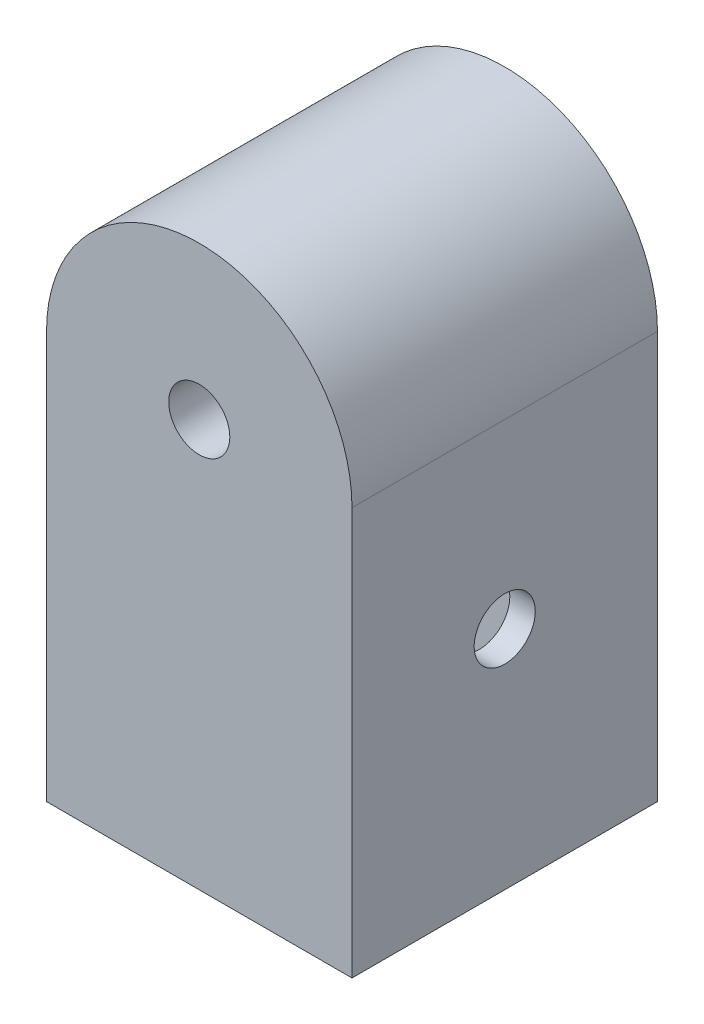
ISO-10303-21;
HEADER;
FILE_DESCRIPTION(('STEP AP214'),'2;1');
FILE_NAME('part.step','',(''),(''),'','','');
FILE_SCHEMA(('AUTOMOTIVE_DESIGN { 1 0 10303 214 1 1 1 1 }'));
ENDSEC;
DATA;
#1=APPLICATION_CONTEXT('core data for automotive mechanical design processes');
#2=APPLICATION_PROTOCOL_DEFINITION('international standard','automotive_design',2000,#1);
#3=PRODUCT_CONTEXT('',#1,'mechanical');
#4=PRODUCT('Part','Part','',(#3));
#5=PRODUCT_RELATED_PRODUCT_CATEGORY('part','',(#4));
#6=PRODUCT_DEFINITION_FORMATION('','',#4);
#7=PRODUCT_DEFINITION_CONTEXT('part definition',#1,'design');
#8=PRODUCT_DEFINITION('design','',#6,#7);
#9=PRODUCT_DEFINITION_SHAPE('','',#8);
#10=(LENGTH_UNIT() NAMED_UNIT(*) SI_UNIT(.MILLI.,.METRE.));
#11=(NAMED_UNIT(*) PLANE_ANGLE_UNIT() SI_UNIT($,.RADIAN.));
#12=(NAMED_UNIT(*) SI_UNIT($,.STERADIAN.) SOLID_ANGLE_UNIT());
#13=UNCERTAINTY_MEASURE_WITH_UNIT(LENGTH_MEASURE(1.E-05),#10,'distance_accuracy_value','');
#14=(GEOMETRIC_REPRESENTATION_CONTEXT(3) GLOBAL_UNCERTAINTY_ASSIGNED_CONTEXT((#13)) GLOBAL_UNIT_ASSIGNED_CONTEXT((#10,
#11,#12)) REPRESENTATION_CONTEXT('',''));
#15=CARTESIAN_POINT('',(0.,0.,0.));
#16=DIRECTION('',(0.,0.,1.));
#17=DIRECTION('',(1.,0.,0.));
#18=AXIS2_PLACEMENT_3D('',#15,#16,#17);
#19=CARTESIAN_POINT('',(7.5,20.,-7.5));
#20=DIRECTION('',(-1.,0.,0.));
#21=DIRECTION('',(0.,0.,1.));
#22=AXIS2_PLACEMENT_3D('',#19,#20,#21);
#23=PLANE('',#22);
#24=CARTESIAN_POINT('',(7.5,11.0968575150693,0.));
#25=DIRECTION('',(1.,0.,0.));
#26=DIRECTION('',(0.,0.,-1.));
#27=AXIS2_PLACEMENT_3D('',#24,#25,#26);
#28=CIRCLE('',#27,1.5);
#29=CARTESIAN_POINT('',(7.5,11.0968575150693,-1.5));
#30=VERTEX_POINT('',#29);
#31=EDGE_CURVE('E180',#30,#30,#28,.T.);
#32=ORIENTED_EDGE('',*,*,#31,.F.);
#33=EDGE_LOOP('',(#32));
#34=FACE_BOUND('',#33,.T.);
#35=DIRECTION('',(0.,0.,-1.));
#36=VECTOR('',#35,1.);
#37=CARTESIAN_POINT('',(7.5,0.,-7.5));
#38=LINE('',#37,#36);
#39=CARTESIAN_POINT('',(7.5,0.,7.5));
#40=VERTEX_POINT('',#39);
#41=CARTESIAN_POINT('',(7.5,0.,-7.5));
#42=VERTEX_POINT('',#41);
#43=EDGE_CURVE('E160',#40,#42,#38,.T.);
#44=ORIENTED_EDGE('',*,*,#43,.T.);
#45=DIRECTION('',(0.,-1.,0.));
#46=VECTOR('',#45,1.);
#47=CARTESIAN_POINT('',(7.5,20.,-7.5));
#48=LINE('',#47,#46);
#49=CARTESIAN_POINT('',(7.5,20.,-7.5));
#50=VERTEX_POINT('',#49);
#51=EDGE_CURVE('E11',#50,#42,#48,.T.);
#52=ORIENTED_EDGE('',*,*,#51,.F.);
#53=DIRECTION('',(0.,0.,-1.));
#54=VECTOR('',#53,1.);
#55=CARTESIAN_POINT('',(7.5,20.,-7.5));
#56=LINE('',#55,#54);
#57=CARTESIAN_POINT('',(7.5,20.,7.5));
#58=VERTEX_POINT('',#57);
#59=EDGE_CURVE('E118',#58,#50,#56,.T.);
#60=ORIENTED_EDGE('',*,*,#59,.F.);
#61=DIRECTION('',(0.,-1.,0.));
#62=VECTOR('',#61,1.);
#63=CARTESIAN_POINT('',(7.5,20.,7.5));
#64=LINE('',#63,#62);
#65=EDGE_CURVE('E62',#58,#40,#64,.T.);
#66=ORIENTED_EDGE('',*,*,#65,.T.);
#67=EDGE_LOOP('',(#44,#52,#60,#66));
#68=FACE_BOUND('',#67,.T.);
#69=ADVANCED_FACE('F38',(#34,#68),#23,.F.);
#70=CARTESIAN_POINT('',(-7.5,20.,-7.5));
#71=DIRECTION('',(0.,0.,1.));
#72=DIRECTION('',(1.,0.,0.));
#73=AXIS2_PLACEMENT_3D('',#70,#71,#72);
#74=PLANE('',#73);
#75=CARTESIAN_POINT('',(0.,20.,-7.5));
#76=DIRECTION('',(0.,0.,1.));
#77=DIRECTION('',(1.,0.,0.));
#78=AXIS2_PLACEMENT_3D('',#75,#76,#77);
#79=CIRCLE('',#78,1.5);
#80=CARTESIAN_POINT('',(1.5,20.,-7.5));
#81=VERTEX_POINT('',#80);
#82=EDGE_CURVE('E183',#81,#81,#79,.T.);
#83=ORIENTED_EDGE('',*,*,#82,.T.);
#84=EDGE_LOOP('',(#83));
#85=FACE_BOUND('',#84,.T.);
#86=DIRECTION('',(-1.,0.,0.));
#87=VECTOR('',#86,1.);
#88=CARTESIAN_POINT('',(-7.5,0.,-7.5));
#89=LINE('',#88,#87);
#90=CARTESIAN_POINT('',(-7.5,0.,-7.5));
#91=VERTEX_POINT('',#90);
#92=EDGE_CURVE('E124',#42,#91,#89,.T.);
#93=ORIENTED_EDGE('',*,*,#92,.T.);
#94=DIRECTION('',(0.,-1.,0.));
#95=VECTOR('',#94,1.);
#96=CARTESIAN_POINT('',(-7.5,20.,-7.5));
#97=LINE('',#96,#95);
#98=CARTESIAN_POINT('',(-7.5,20.,-7.5));
#99=VERTEX_POINT('',#98);
#100=EDGE_CURVE('E46',#99,#91,#97,.T.);
#101=ORIENTED_EDGE('',*,*,#100,.F.);
#102=CARTESIAN_POINT('',(0.,20.,-7.5));
#103=DIRECTION('',(0.,0.,-1.));
#104=DIRECTION('',(-1.,0.,0.));
#105=AXIS2_PLACEMENT_3D('',#102,#103,#104);
#106=CIRCLE('',#105,7.5);
#107=EDGE_CURVE('E123',#99,#50,#106,.T.);
#108=ORIENTED_EDGE('',*,*,#107,.T.);
#109=ORIENTED_EDGE('',*,*,#51,.T.);
#110=EDGE_LOOP('',(#93,#101,#108,#109));
#111=FACE_BOUND('',#110,.T.);
#112=ADVANCED_FACE('F122',(#85,#111),#74,.F.);
#113=CARTESIAN_POINT('',(-7.5,20.,-7.5));
#114=DIRECTION('',(1.,0.,0.));
#115=DIRECTION('',(0.,0.,-1.));
#116=AXIS2_PLACEMENT_3D('',#113,#114,#115);
#117=PLANE('',#116);
#118=CARTESIAN_POINT('',(-7.5,11.0968575150693,0.));
#119=DIRECTION('',(1.,0.,0.));
#120=DIRECTION('',(0.,0.,-1.));
#121=AXIS2_PLACEMENT_3D('',#118,#119,#120);
#122=CIRCLE('',#121,1.5);
#123=CARTESIAN_POINT('',(-7.5,11.0968575150693,-1.5));
#124=VERTEX_POINT('',#123);
#125=EDGE_CURVE('E182',#124,#124,#122,.T.);
#126=ORIENTED_EDGE('',*,*,#125,.T.);
#127=EDGE_LOOP('',(#126));
#128=FACE_BOUND('',#127,.T.);
#129=DIRECTION('',(0.,0.,1.));
#130=VECTOR('',#129,1.);
#131=CARTESIAN_POINT('',(-7.5,0.,-7.5));
#132=LINE('',#131,#130);
#133=CARTESIAN_POINT('',(-7.5,0.,7.5));
#134=VERTEX_POINT('',#133);
#135=EDGE_CURVE('E164',#91,#134,#132,.T.);
#136=ORIENTED_EDGE('',*,*,#135,.T.);
#137=DIRECTION('',(0.,-1.,0.));
#138=VECTOR('',#137,1.);
#139=CARTESIAN_POINT('',(-7.5,20.,7.5));
#140=LINE('',#139,#138);
#141=CARTESIAN_POINT('',(-7.5,20.,7.5));
#142=VERTEX_POINT('',#141);
#143=EDGE_CURVE('E114',#142,#134,#140,.T.);
#144=ORIENTED_EDGE('',*,*,#143,.F.);
#145=DIRECTION('',(0.,0.,1.));
#146=VECTOR('',#145,1.);
#147=CARTESIAN_POINT('',(-7.5,20.,-7.5));
#148=LINE('',#147,#146);
#149=EDGE_CURVE('E110',#99,#142,#148,.T.);
#150=ORIENTED_EDGE('',*,*,#149,.F.);
#151=ORIENTED_EDGE('',*,*,#100,.T.);
#152=EDGE_LOOP('',(#136,#144,#150,#151));
#153=FACE_BOUND('',#152,.T.);
#154=ADVANCED_FACE('F112',(#128,#153),#117,.F.);
#155=CARTESIAN_POINT('',(-7.5,20.,7.5));
#156=DIRECTION('',(0.,0.,-1.));
#157=DIRECTION('',(-1.,0.,0.));
#158=AXIS2_PLACEMENT_3D('',#155,#156,#157);
#159=PLANE('',#158);
#160=CARTESIAN_POINT('',(0.,20.,7.5));
#161=DIRECTION('',(0.,0.,1.));
#162=DIRECTION('',(1.,0.,0.));
#163=AXIS2_PLACEMENT_3D('',#160,#161,#162);
#164=CIRCLE('',#163,1.5);
#165=CARTESIAN_POINT('',(1.5,20.,7.5));
#166=VERTEX_POINT('',#165);
#167=EDGE_CURVE('E188',#166,#166,#164,.T.);
#168=ORIENTED_EDGE('',*,*,#167,.F.);
#169=EDGE_LOOP('',(#168));
#170=FACE_BOUND('',#169,.T.);
#171=DIRECTION('',(1.,0.,0.));
#172=VECTOR('',#171,1.);
#173=CARTESIAN_POINT('',(-7.5,0.,7.5));
#174=LINE('',#173,#172);
#175=EDGE_CURVE('E81',#134,#40,#174,.T.);
#176=ORIENTED_EDGE('',*,*,#175,.T.);
#177=ORIENTED_EDGE('',*,*,#65,.F.);
#178=CARTESIAN_POINT('',(0.,20.,7.5));
#179=DIRECTION('',(0.,0.,-1.));
#180=DIRECTION('',(-1.,0.,0.));
#181=AXIS2_PLACEMENT_3D('',#178,#179,#180);
#182=CIRCLE('',#181,7.5);
#183=EDGE_CURVE('E127',#142,#58,#182,.T.);
#184=ORIENTED_EDGE('',*,*,#183,.F.);
#185=ORIENTED_EDGE('',*,*,#143,.T.);
#186=EDGE_LOOP('',(#176,#177,#184,#185));
#187=FACE_BOUND('',#186,.T.);
#188=ADVANCED_FACE('F168',(#170,#187),#159,.F.);
#189=CARTESIAN_POINT('',(0.,0.,0.));
#190=DIRECTION('',(0.,1.,0.));
#191=DIRECTION('',(0.,0.,1.));
#192=AXIS2_PLACEMENT_3D('',#189,#190,#191);
#193=PLANE('',#192);
#194=DIRECTION('',(-1.,0.,0.));
#195=VECTOR('',#194,1.);
#196=CARTESIAN_POINT('',(-6.25,0.,6.25));
#197=LINE('',#196,#195);
#198=CARTESIAN_POINT('',(6.25,0.,6.25));
#199=VERTEX_POINT('',#198);
#200=CARTESIAN_POINT('',(-6.25,0.,6.25));
#201=VERTEX_POINT('',#200);
#202=EDGE_CURVE('E137',#199,#201,#197,.T.);
#203=ORIENTED_EDGE('',*,*,#202,.F.);
#204=DIRECTION('',(0.,0.,1.));
#205=VECTOR('',#204,1.);
#206=CARTESIAN_POINT('',(6.25,0.,-6.25));
#207=LINE('',#206,#205);
#208=CARTESIAN_POINT('',(6.25,0.,-6.25));
#209=VERTEX_POINT('',#208);
#210=EDGE_CURVE('E140',#209,#199,#207,.T.);
#211=ORIENTED_EDGE('',*,*,#210,.F.);
#212=DIRECTION('',(1.,0.,0.));
#213=VECTOR('',#212,1.);
#214=CARTESIAN_POINT('',(-6.25,0.,-6.25));
#215=LINE('',#214,#213);
#216=CARTESIAN_POINT('',(-6.25,0.,-6.25));
#217=VERTEX_POINT('',#216);
#218=EDGE_CURVE('E142',#217,#209,#215,.T.);
#219=ORIENTED_EDGE('',*,*,#218,.F.);
#220=DIRECTION('',(0.,0.,-1.));
#221=VECTOR('',#220,1.);
#222=CARTESIAN_POINT('',(-6.25,0.,-6.25));
#223=LINE('',#222,#221);
#224=EDGE_CURVE('E135',#201,#217,#223,.T.);
#225=ORIENTED_EDGE('',*,*,#224,.F.);
#226=EDGE_LOOP('',(#203,#211,#219,#225));
#227=FACE_BOUND('',#226,.T.);
#228=ORIENTED_EDGE('',*,*,#43,.F.);
#229=ORIENTED_EDGE('',*,*,#175,.F.);
#230=ORIENTED_EDGE('',*,*,#135,.F.);
#231=ORIENTED_EDGE('',*,*,#92,.F.);
#232=EDGE_LOOP('',(#228,#229,#230,#231));
#233=FACE_BOUND('',#232,.T.);
#234=ADVANCED_FACE('F171',(#227,#233),#193,.F.);
#235=CARTESIAN_POINT('',(6.25,-17.6776695296637,-6.25));
#236=DIRECTION('',(1.,0.,0.));
#237=DIRECTION('',(0.,0.,-1.));
#238=AXIS2_PLACEMENT_3D('',#235,#236,#237);
#239=PLANE('',#238);
#240=CARTESIAN_POINT('',(6.25,11.0968575150693,0.));
#241=DIRECTION('',(1.,0.,0.));
#242=DIRECTION('',(0.,0.,-1.));
#243=AXIS2_PLACEMENT_3D('',#240,#241,#242);
#244=CIRCLE('',#243,1.5);
#245=CARTESIAN_POINT('',(6.25,11.0968575150693,-1.5));
#246=VERTEX_POINT('',#245);
#247=EDGE_CURVE('E128',#246,#246,#244,.T.);
#248=ORIENTED_EDGE('',*,*,#247,.T.);
#249=EDGE_LOOP('',(#248));
#250=FACE_BOUND('',#249,.T.);
#251=ORIENTED_EDGE('',*,*,#210,.T.);
#252=DIRECTION('',(0.,1.,0.));
#253=VECTOR('',#252,1.);
#254=CARTESIAN_POINT('',(6.25,-17.6776695296637,6.25));
#255=LINE('',#254,#253);
#256=CARTESIAN_POINT('',(6.25,17.,6.25));
#257=VERTEX_POINT('',#256);
#258=EDGE_CURVE('E138',#199,#257,#255,.T.);
#259=ORIENTED_EDGE('',*,*,#258,.T.);
#260=DIRECTION('',(0.,0.,-1.));
#261=VECTOR('',#260,1.);
#262=CARTESIAN_POINT('',(6.25,17.,-6.25));
#263=LINE('',#262,#261);
#264=CARTESIAN_POINT('',(6.25,17.,-6.25));
#265=VERTEX_POINT('',#264);
#266=EDGE_CURVE('E130',#257,#265,#263,.T.);
#267=ORIENTED_EDGE('',*,*,#266,.T.);
#268=DIRECTION('',(0.,1.,0.));
#269=VECTOR('',#268,1.);
#270=CARTESIAN_POINT('',(6.25,-17.6776695296637,-6.25));
#271=LINE('',#270,#269);
#272=EDGE_CURVE('E153',#209,#265,#271,.T.);
#273=ORIENTED_EDGE('',*,*,#272,.F.);
#274=EDGE_LOOP('',(#251,#259,#267,#273));
#275=FACE_BOUND('',#274,.T.);
#276=ADVANCED_FACE('F202',(#250,#275),#239,.F.);
#277=CARTESIAN_POINT('',(-6.25,-17.6776695296637,6.25));
#278=DIRECTION('',(0.,0.,1.));
#279=DIRECTION('',(1.,0.,0.));
#280=AXIS2_PLACEMENT_3D('',#277,#278,#279);
#281=PLANE('',#280);
#282=ORIENTED_EDGE('',*,*,#202,.T.);
#283=DIRECTION('',(0.,1.,0.));
#284=VECTOR('',#283,1.);
#285=CARTESIAN_POINT('',(-6.25,-17.6776695296637,6.25));
#286=LINE('',#285,#284);
#287=CARTESIAN_POINT('',(-6.25,17.,6.25));
#288=VERTEX_POINT('',#287);
#289=EDGE_CURVE('E155',#201,#288,#286,.T.);
#290=ORIENTED_EDGE('',*,*,#289,.T.);
#291=DIRECTION('',(1.,0.,0.));
#292=VECTOR('',#291,1.);
#293=CARTESIAN_POINT('',(-6.25,17.,6.25));
#294=LINE('',#293,#292);
#295=EDGE_CURVE('E150',#288,#257,#294,.T.);
#296=ORIENTED_EDGE('',*,*,#295,.T.);
#297=ORIENTED_EDGE('',*,*,#258,.F.);
#298=EDGE_LOOP('',(#282,#290,#296,#297));
#299=FACE_BOUND('',#298,.T.);
#300=ADVANCED_FACE('F210',(#299),#281,.F.);
#301=CARTESIAN_POINT('',(-6.25,-17.6776695296637,-6.25));
#302=DIRECTION('',(-1.,0.,0.));
#303=DIRECTION('',(0.,0.,1.));
#304=AXIS2_PLACEMENT_3D('',#301,#302,#303);
#305=PLANE('',#304);
#306=CARTESIAN_POINT('',(-6.25,11.0968575150693,0.));
#307=DIRECTION('',(-1.,0.,0.));
#308=DIRECTION('',(0.,0.,1.));
#309=AXIS2_PLACEMENT_3D('',#306,#307,#308);
#310=CIRCLE('',#309,1.5);
#311=CARTESIAN_POINT('',(-6.25,11.0968575150693,-1.5));
#312=VERTEX_POINT('',#311);
#313=EDGE_CURVE('E41',#312,#312,#310,.T.);
#314=ORIENTED_EDGE('',*,*,#313,.T.);
#315=EDGE_LOOP('',(#314));
#316=FACE_BOUND('',#315,.T.);
#317=ORIENTED_EDGE('',*,*,#224,.T.);
#318=DIRECTION('',(0.,1.,0.));
#319=VECTOR('',#318,1.);
#320=CARTESIAN_POINT('',(-6.25,-17.6776695296637,-6.25));
#321=LINE('',#320,#319);
#322=CARTESIAN_POINT('',(-6.25,17.,-6.25));
#323=VERTEX_POINT('',#322);
#324=EDGE_CURVE('E53',#217,#323,#321,.T.);
#325=ORIENTED_EDGE('',*,*,#324,.T.);
#326=DIRECTION('',(0.,0.,1.));
#327=VECTOR('',#326,1.);
#328=CARTESIAN_POINT('',(-6.25,17.,-6.25));
#329=LINE('',#328,#327);
#330=EDGE_CURVE('E147',#323,#288,#329,.T.);
#331=ORIENTED_EDGE('',*,*,#330,.T.);
#332=ORIENTED_EDGE('',*,*,#289,.F.);
#333=EDGE_LOOP('',(#317,#325,#331,#332));
#334=FACE_BOUND('',#333,.T.);
#335=ADVANCED_FACE('F216',(#316,#334),#305,.F.);
#336=CARTESIAN_POINT('',(-6.25,-17.6776695296637,-6.25));
#337=DIRECTION('',(0.,0.,-1.));
#338=DIRECTION('',(-1.,0.,0.));
#339=AXIS2_PLACEMENT_3D('',#336,#337,#338);
#340=PLANE('',#339);
#341=ORIENTED_EDGE('',*,*,#218,.T.);
#342=ORIENTED_EDGE('',*,*,#272,.T.);
#343=DIRECTION('',(-1.,0.,0.));
#344=VECTOR('',#343,1.);
#345=CARTESIAN_POINT('',(-6.25,17.,-6.25));
#346=LINE('',#345,#344);
#347=EDGE_CURVE('E145',#265,#323,#346,.T.);
#348=ORIENTED_EDGE('',*,*,#347,.T.);
#349=ORIENTED_EDGE('',*,*,#324,.F.);
#350=EDGE_LOOP('',(#341,#342,#348,#349));
#351=FACE_BOUND('',#350,.T.);
#352=ADVANCED_FACE('F212',(#351),#340,.F.);
#353=CARTESIAN_POINT('',(0.,17.,0.));
#354=DIRECTION('',(0.,1.,0.));
#355=DIRECTION('',(0.,0.,1.));
#356=AXIS2_PLACEMENT_3D('',#353,#354,#355);
#357=PLANE('',#356);
#358=ORIENTED_EDGE('',*,*,#266,.F.);
#359=ORIENTED_EDGE('',*,*,#295,.F.);
#360=ORIENTED_EDGE('',*,*,#330,.F.);
#361=ORIENTED_EDGE('',*,*,#347,.F.);
#362=EDGE_LOOP('',(#358,#359,#360,#361));
#363=FACE_BOUND('',#362,.T.);
#364=ADVANCED_FACE('F215',(#363),#357,.F.);
#365=CARTESIAN_POINT('',(0.,20.,7.5));
#366=DIRECTION('',(0.,0.,-1.));
#367=DIRECTION('',(-1.,0.,0.));
#368=AXIS2_PLACEMENT_3D('',#365,#366,#367);
#369=CYLINDRICAL_SURFACE('',#368,7.5);
#370=ORIENTED_EDGE('',*,*,#107,.F.);
#371=ORIENTED_EDGE('',*,*,#149,.T.);
#372=ORIENTED_EDGE('',*,*,#183,.T.);
#373=ORIENTED_EDGE('',*,*,#59,.T.);
#374=EDGE_LOOP('',(#370,#371,#372,#373));
#375=FACE_BOUND('',#374,.T.);
#376=ADVANCED_FACE('F126',(#375),#369,.T.);
#377=CARTESIAN_POINT('',(-7.5,11.0968575150693,0.));
#378=DIRECTION('',(1.,0.,0.));
#379=DIRECTION('',(0.,0.,-1.));
#380=AXIS2_PLACEMENT_3D('',#377,#378,#379);
#381=CYLINDRICAL_SURFACE('',#380,1.5);
#382=CARTESIAN_POINT('',(-7.5,11.0968575150693,-1.5));
#383=CARTESIAN_POINT('',(-7.48697916666667,11.0968575150693,-1.5));
#384=CARTESIAN_POINT('',(-7.47395833333334,11.0968575150693,-1.5));
#385=CARTESIAN_POINT('',(-7.44791666666667,11.0968575150693,-1.5));
#386=CARTESIAN_POINT('',(-7.43489583333334,11.0968575150693,-1.5));
#387=CARTESIAN_POINT('',(-7.40885416666667,11.0968575150693,-1.5));
#388=CARTESIAN_POINT('',(-7.39583333333334,11.0968575150693,-1.5));
#389=CARTESIAN_POINT('',(-7.36979166666667,11.0968575150693,-1.5));
#390=CARTESIAN_POINT('',(-7.35677083333334,11.0968575150693,-1.5));
#391=CARTESIAN_POINT('',(-7.33072916666667,11.0968575150693,-1.5));
#392=CARTESIAN_POINT('',(-7.31770833333334,11.0968575150693,-1.5));
#393=CARTESIAN_POINT('',(-7.29166666666667,11.0968575150693,-1.5));
#394=CARTESIAN_POINT('',(-7.27864583333334,11.0968575150693,-1.5));
#395=CARTESIAN_POINT('',(-7.25260416666667,11.0968575150693,-1.5));
#396=CARTESIAN_POINT('',(-7.23958333333334,11.0968575150693,-1.5));
#397=CARTESIAN_POINT('',(-7.21354166666667,11.0968575150693,-1.5));
#398=CARTESIAN_POINT('',(-7.20052083333334,11.0968575150693,-1.5));
#399=CARTESIAN_POINT('',(-7.17447916666667,11.0968575150693,-1.5));
#400=CARTESIAN_POINT('',(-7.16145833333334,11.0968575150693,-1.5));
#401=CARTESIAN_POINT('',(-7.13541666666667,11.0968575150693,-1.5));
#402=CARTESIAN_POINT('',(-7.12239583333334,11.0968575150693,-1.5));
#403=CARTESIAN_POINT('',(-7.09635416666667,11.0968575150693,-1.5));
#404=CARTESIAN_POINT('',(-7.08333333333334,11.0968575150693,-1.5));
#405=CARTESIAN_POINT('',(-7.05729166666667,11.0968575150693,-1.5));
#406=CARTESIAN_POINT('',(-7.04427083333334,11.0968575150693,-1.5));
#407=CARTESIAN_POINT('',(-7.01822916666667,11.0968575150693,-1.5));
#408=CARTESIAN_POINT('',(-7.00520833333334,11.0968575150693,-1.5));
#409=CARTESIAN_POINT('',(-6.97916666666667,11.0968575150693,-1.5));
#410=CARTESIAN_POINT('',(-6.96614583333334,11.0968575150693,-1.5));
#411=CARTESIAN_POINT('',(-6.94010416666667,11.0968575150693,-1.5));
#412=CARTESIAN_POINT('',(-6.92708333333334,11.0968575150693,-1.5));
#413=CARTESIAN_POINT('',(-6.90104166666667,11.0968575150693,-1.5));
#414=CARTESIAN_POINT('',(-6.88802083333334,11.0968575150693,-1.5));
#415=CARTESIAN_POINT('',(-6.86197916666667,11.0968575150693,-1.5));
#416=CARTESIAN_POINT('',(-6.84895833333334,11.0968575150693,-1.5));
#417=CARTESIAN_POINT('',(-6.82291666666667,11.0968575150693,-1.5));
#418=CARTESIAN_POINT('',(-6.80989583333334,11.0968575150693,-1.5));
#419=CARTESIAN_POINT('',(-6.78385416666667,11.0968575150693,-1.5));
#420=CARTESIAN_POINT('',(-6.77083333333334,11.0968575150693,-1.5));
#421=CARTESIAN_POINT('',(-6.74479166666667,11.0968575150693,-1.5));
#422=CARTESIAN_POINT('',(-6.73177083333334,11.0968575150693,-1.5));
#423=CARTESIAN_POINT('',(-6.70572916666667,11.0968575150693,-1.5));
#424=CARTESIAN_POINT('',(-6.69270833333334,11.0968575150693,-1.5));
#425=CARTESIAN_POINT('',(-6.66666666666667,11.0968575150693,-1.5));
#426=CARTESIAN_POINT('',(-6.65364583333334,11.0968575150693,-1.5));
#427=CARTESIAN_POINT('',(-6.62760416666667,11.0968575150693,-1.5));
#428=CARTESIAN_POINT('',(-6.61458333333333,11.0968575150693,-1.5));
#429=CARTESIAN_POINT('',(-6.58854166666667,11.0968575150693,-1.5));
#430=CARTESIAN_POINT('',(-6.57552083333333,11.0968575150693,-1.5));
#431=CARTESIAN_POINT('',(-6.54947916666667,11.0968575150693,-1.5));
#432=CARTESIAN_POINT('',(-6.53645833333333,11.0968575150693,-1.5));
#433=CARTESIAN_POINT('',(-6.51041666666667,11.0968575150693,-1.5));
#434=CARTESIAN_POINT('',(-6.49739583333333,11.0968575150693,-1.5));
#435=CARTESIAN_POINT('',(-6.47135416666667,11.0968575150693,-1.5));
#436=CARTESIAN_POINT('',(-6.45833333333333,11.0968575150693,-1.5));
#437=CARTESIAN_POINT('',(-6.43229166666667,11.0968575150693,-1.5));
#438=CARTESIAN_POINT('',(-6.41927083333333,11.0968575150693,-1.5));
#439=CARTESIAN_POINT('',(-6.39322916666667,11.0968575150693,-1.5));
#440=CARTESIAN_POINT('',(-6.38020833333333,11.0968575150693,-1.5));
#441=CARTESIAN_POINT('',(-6.35416666666667,11.0968575150693,-1.5));
#442=CARTESIAN_POINT('',(-6.34114583333333,11.0968575150693,-1.5));
#443=CARTESIAN_POINT('',(-6.31510416666667,11.0968575150693,-1.5));
#444=CARTESIAN_POINT('',(-6.30208333333333,11.0968575150693,-1.5));
#445=CARTESIAN_POINT('',(-6.27604166666667,11.0968575150693,-1.5));
#446=CARTESIAN_POINT('',(-6.26302083333333,11.0968575150693,-1.5));
#447=CARTESIAN_POINT('',(-6.25,11.0968575150693,-1.5));
#448=B_SPLINE_CURVE_WITH_KNOTS('',3,(#382,#383,#384,#385,#386,#387,#388,#389,#390,#391,#392,
#393,#394,#395,#396,#397,#398,#399,#400,#401,#402,#403,#404,#405,#406,#407,#408,#409,#410,#411,
#412,#413,#414,#415,#416,#417,#418,#419,#420,#421,#422,#423,#424,#425,#426,#427,#428,#429,#430,
#431,#432,#433,#434,#435,#436,#437,#438,#439,#440,#441,#442,#443,#444,#445,#446,#447),
.UNSPECIFIED.,.F.,.F.,(4,2,2,2,2,2,2,2,2,2,2,2,2,2,2,2,2,2,2,2,2,2,2,2,2,2,2,2,2,2,2,2,4),(0.,
0.0390625,0.0781250000000001,0.1171875,0.15625,0.1953125,0.234375,0.2734375,0.3125,0.3515625,
0.390625,0.4296875,0.46875,0.5078125,0.546875,0.585937500000001,0.625000000000001,
0.664062500000001,0.703125000000001,0.742187500000001,0.781250000000001,0.820312500000001,
0.859375000000001,0.898437500000002,0.937500000000001,0.976562500000002,1.015625,1.0546875,
1.09375,1.1328125,1.171875,1.2109375,1.25),.UNSPECIFIED.);
#449=EDGE_CURVE('BSEAM228',#124,#312,#448,.T.);
#450=ORIENTED_EDGE('',*,*,#125,.F.);
#451=ORIENTED_EDGE('',*,*,#313,.F.);
#452=ORIENTED_EDGE('',*,*,#449,.T.);
#453=ORIENTED_EDGE('',*,*,#449,.F.);
#454=EDGE_LOOP('',(#450,#452,#451,#453));
#455=FACE_BOUND('',#454,.T.);
#456=ADVANCED_FACE('F228',(#455),#381,.F.);
#457=CARTESIAN_POINT('',(7.5,11.0968575150693,-1.5));
#458=CARTESIAN_POINT('',(7.48697916666667,11.0968575150693,-1.5));
#459=CARTESIAN_POINT('',(7.47395833333333,11.0968575150693,-1.5));
#460=CARTESIAN_POINT('',(7.44791666666667,11.0968575150693,-1.5));
#461=CARTESIAN_POINT('',(7.43489583333333,11.0968575150693,-1.5));
#462=CARTESIAN_POINT('',(7.40885416666666,11.0968575150693,-1.5));
#463=CARTESIAN_POINT('',(7.39583333333333,11.0968575150693,-1.5));
#464=CARTESIAN_POINT('',(7.36979166666666,11.0968575150693,-1.5));
#465=CARTESIAN_POINT('',(7.35677083333333,11.0968575150693,-1.5));
#466=CARTESIAN_POINT('',(7.33072916666667,11.0968575150693,-1.5));
#467=CARTESIAN_POINT('',(7.31770833333333,11.0968575150693,-1.5));
#468=CARTESIAN_POINT('',(7.29166666666667,11.0968575150693,-1.5));
#469=CARTESIAN_POINT('',(7.27864583333333,11.0968575150693,-1.5));
#470=CARTESIAN_POINT('',(7.25260416666666,11.0968575150693,-1.5));
#471=CARTESIAN_POINT('',(7.23958333333333,11.0968575150693,-1.5));
#472=CARTESIAN_POINT('',(7.21354166666666,11.0968575150693,-1.5));
#473=CARTESIAN_POINT('',(7.20052083333333,11.0968575150693,-1.5));
#474=CARTESIAN_POINT('',(7.17447916666667,11.0968575150693,-1.5));
#475=CARTESIAN_POINT('',(7.16145833333333,11.0968575150693,-1.5));
#476=CARTESIAN_POINT('',(7.13541666666667,11.0968575150693,-1.5));
#477=CARTESIAN_POINT('',(7.12239583333333,11.0968575150693,-1.5));
#478=CARTESIAN_POINT('',(7.09635416666666,11.0968575150693,-1.5));
#479=CARTESIAN_POINT('',(7.08333333333333,11.0968575150693,-1.5));
#480=CARTESIAN_POINT('',(7.05729166666666,11.0968575150693,-1.5));
#481=CARTESIAN_POINT('',(7.04427083333333,11.0968575150693,-1.5));
#482=CARTESIAN_POINT('',(7.01822916666667,11.0968575150693,-1.5));
#483=CARTESIAN_POINT('',(7.00520833333333,11.0968575150693,-1.5));
#484=CARTESIAN_POINT('',(6.97916666666667,11.0968575150693,-1.5));
#485=CARTESIAN_POINT('',(6.96614583333333,11.0968575150693,-1.5));
#486=CARTESIAN_POINT('',(6.94010416666666,11.0968575150693,-1.5));
#487=CARTESIAN_POINT('',(6.92708333333333,11.0968575150693,-1.5));
#488=CARTESIAN_POINT('',(6.90104166666666,11.0968575150693,-1.5));
#489=CARTESIAN_POINT('',(6.88802083333333,11.0968575150693,-1.5));
#490=CARTESIAN_POINT('',(6.86197916666666,11.0968575150693,-1.5));
#491=CARTESIAN_POINT('',(6.84895833333333,11.0968575150693,-1.5));
#492=CARTESIAN_POINT('',(6.82291666666666,11.0968575150693,-1.5));
#493=CARTESIAN_POINT('',(6.80989583333333,11.0968575150693,-1.5));
#494=CARTESIAN_POINT('',(6.78385416666666,11.0968575150693,-1.5));
#495=CARTESIAN_POINT('',(6.77083333333333,11.0968575150693,-1.5));
#496=CARTESIAN_POINT('',(6.74479166666666,11.0968575150693,-1.5));
#497=CARTESIAN_POINT('',(6.73177083333333,11.0968575150693,-1.5));
#498=CARTESIAN_POINT('',(6.70572916666666,11.0968575150693,-1.5));
#499=CARTESIAN_POINT('',(6.69270833333333,11.0968575150693,-1.5));
#500=CARTESIAN_POINT('',(6.66666666666666,11.0968575150693,-1.5));
#501=CARTESIAN_POINT('',(6.65364583333333,11.0968575150693,-1.5));
#502=CARTESIAN_POINT('',(6.62760416666666,11.0968575150693,-1.5));
#503=CARTESIAN_POINT('',(6.61458333333333,11.0968575150693,-1.5));
#504=CARTESIAN_POINT('',(6.58854166666666,11.0968575150693,-1.5));
#505=CARTESIAN_POINT('',(6.57552083333333,11.0968575150693,-1.5));
#506=CARTESIAN_POINT('',(6.54947916666666,11.0968575150693,-1.5));
#507=CARTESIAN_POINT('',(6.53645833333333,11.0968575150693,-1.5));
#508=CARTESIAN_POINT('',(6.51041666666666,11.0968575150693,-1.5));
#509=CARTESIAN_POINT('',(6.49739583333333,11.0968575150693,-1.5));
#510=CARTESIAN_POINT('',(6.47135416666666,11.0968575150693,-1.5));
#511=CARTESIAN_POINT('',(6.45833333333333,11.0968575150693,-1.5));
#512=CARTESIAN_POINT('',(6.43229166666666,11.0968575150693,-1.5));
#513=CARTESIAN_POINT('',(6.41927083333333,11.0968575150693,-1.5));
#514=CARTESIAN_POINT('',(6.39322916666666,11.0968575150693,-1.5));
#515=CARTESIAN_POINT('',(6.38020833333333,11.0968575150693,-1.5));
#516=CARTESIAN_POINT('',(6.35416666666666,11.0968575150693,-1.5));
#517=CARTESIAN_POINT('',(6.34114583333333,11.0968575150693,-1.5));
#518=CARTESIAN_POINT('',(6.31510416666666,11.0968575150693,-1.5));
#519=CARTESIAN_POINT('',(6.30208333333333,11.0968575150693,-1.5));
#520=CARTESIAN_POINT('',(6.27604166666666,11.0968575150693,-1.5));
#521=CARTESIAN_POINT('',(6.26302083333333,11.0968575150693,-1.5));
#522=CARTESIAN_POINT('',(6.25,11.0968575150693,-1.5));
#523=B_SPLINE_CURVE_WITH_KNOTS('',3,(#457,#458,#459,#460,#461,#462,#463,#464,#465,#466,#467,
#468,#469,#470,#471,#472,#473,#474,#475,#476,#477,#478,#479,#480,#481,#482,#483,#484,#485,#486,
#487,#488,#489,#490,#491,#492,#493,#494,#495,#496,#497,#498,#499,#500,#501,#502,#503,#504,#505,
#506,#507,#508,#509,#510,#511,#512,#513,#514,#515,#516,#517,#518,#519,#520,#521,#522),
.UNSPECIFIED.,.F.,.F.,(4,2,2,2,2,2,2,2,2,2,2,2,2,2,2,2,2,2,2,2,2,2,2,2,2,2,2,2,2,2,2,2,4),(0.,
0.0390624999999992,0.0781250000000001,0.117187500000001,0.15625,0.195312499999999,0.234375,
0.273437500000001,0.3125,0.351562499999999,0.390625,0.429687500000001,0.46875,0.5078125,
0.546875,0.585937500000001,0.625000000000001,0.6640625,0.703125000000001,0.742187500000002,
0.781250000000001,0.8203125,0.859375000000001,0.898437500000002,0.937500000000001,0.9765625,
1.015625,1.0546875,1.09375,1.1328125,1.171875,1.2109375,1.25),.UNSPECIFIED.);
#524=EDGE_CURVE('BSEAM229',#30,#246,#523,.T.);
#525=ORIENTED_EDGE('',*,*,#31,.T.);
#526=ORIENTED_EDGE('',*,*,#247,.F.);
#527=ORIENTED_EDGE('',*,*,#524,.T.);
#528=ORIENTED_EDGE('',*,*,#524,.F.);
#529=EDGE_LOOP('',(#525,#527,#526,#528));
#530=FACE_BOUND('',#529,.T.);
#531=ADVANCED_FACE('F229',(#530),#381,.F.);
#532=CARTESIAN_POINT('',(0.,20.,-7.5));
#533=DIRECTION('',(0.,0.,1.));
#534=DIRECTION('',(1.,0.,0.));
#535=AXIS2_PLACEMENT_3D('',#532,#533,#534);
#536=CYLINDRICAL_SURFACE('',#535,1.5);
#537=ORIENTED_EDGE('',*,*,#82,.F.);
#538=EDGE_LOOP('',(#537));
#539=FACE_BOUND('',#538,.T.);
#540=ORIENTED_EDGE('',*,*,#167,.T.);
#541=EDGE_LOOP('',(#540));
#542=FACE_BOUND('',#541,.T.);
#543=ADVANCED_FACE('F194',(#539,#542),#536,.F.);
#544=CLOSED_SHELL('',(#69,#112,#154,#188,#234,#276,#300,#335,#352,#364,#376,#456,#531,#543));
#545=MANIFOLD_SOLID_BREP('B2',#544);
#546=ADVANCED_BREP_SHAPE_REPRESENTATION('',(#18,#545),#14);
#547=SHAPE_DEFINITION_REPRESENTATION(#9,#546);
ENDSEC;
END-ISO-10303-21;
